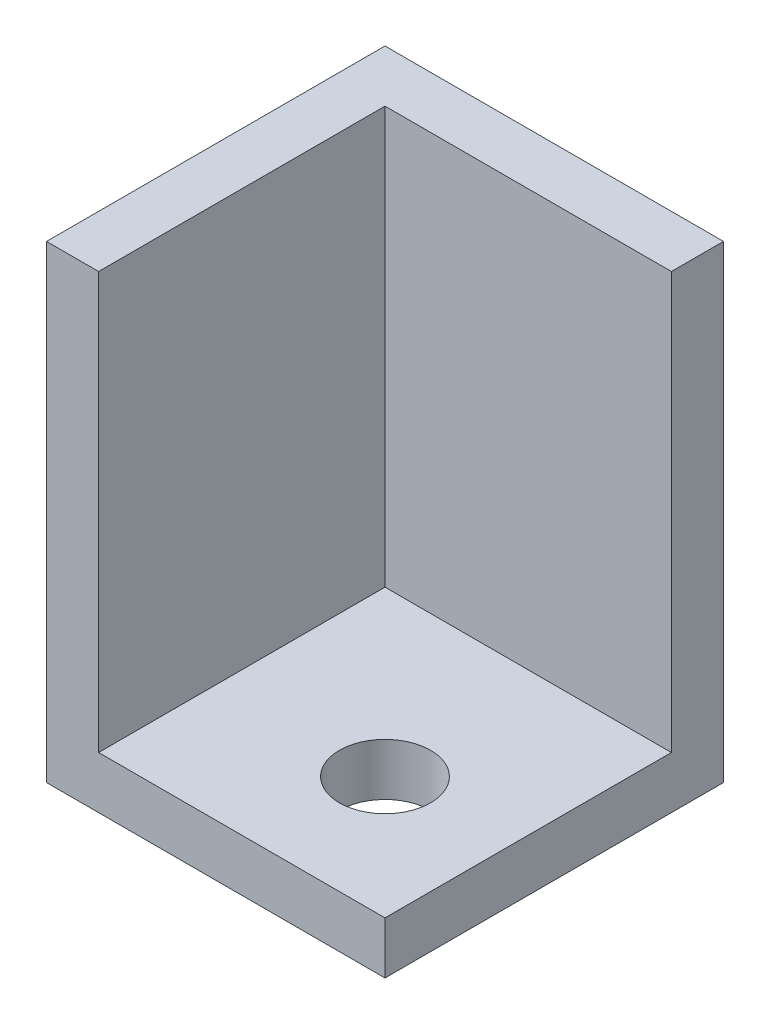
ISO-10303-21;
HEADER;
FILE_DESCRIPTION(('STEP AP214'),'2;1');
FILE_NAME('part.step','',(''),(''),'','','');
FILE_SCHEMA(('AUTOMOTIVE_DESIGN { 1 0 10303 214 1 1 1 1 }'));
ENDSEC;
DATA;
#1=APPLICATION_CONTEXT('core data for automotive mechanical design processes');
#2=APPLICATION_PROTOCOL_DEFINITION('international standard','automotive_design',2000,#1);
#3=PRODUCT_CONTEXT('',#1,'mechanical');
#4=PRODUCT('Part','Part','',(#3));
#5=PRODUCT_RELATED_PRODUCT_CATEGORY('part','',(#4));
#6=PRODUCT_DEFINITION_FORMATION('','',#4);
#7=PRODUCT_DEFINITION_CONTEXT('part definition',#1,'design');
#8=PRODUCT_DEFINITION('design','',#6,#7);
#9=PRODUCT_DEFINITION_SHAPE('','',#8);
#10=(LENGTH_UNIT() NAMED_UNIT(*) SI_UNIT(.MILLI.,.METRE.));
#11=(NAMED_UNIT(*) PLANE_ANGLE_UNIT() SI_UNIT($,.RADIAN.));
#12=(NAMED_UNIT(*) SI_UNIT($,.STERADIAN.) SOLID_ANGLE_UNIT());
#13=UNCERTAINTY_MEASURE_WITH_UNIT(LENGTH_MEASURE(1.E-05),#10,'distance_accuracy_value','');
#14=(GEOMETRIC_REPRESENTATION_CONTEXT(3) GLOBAL_UNCERTAINTY_ASSIGNED_CONTEXT((#13)) GLOBAL_UNIT_ASSIGNED_CONTEXT((#10,
#11,#12)) REPRESENTATION_CONTEXT('',''));
#15=CARTESIAN_POINT('',(0.,0.,0.));
#16=DIRECTION('',(0.,0.,1.));
#17=DIRECTION('',(1.,0.,0.));
#18=AXIS2_PLACEMENT_3D('',#15,#16,#17);
#19=CARTESIAN_POINT('',(-6.5,2.,6.5));
#20=DIRECTION('',(1.,0.,0.));
#21=DIRECTION('',(0.,0.,-1.));
#22=AXIS2_PLACEMENT_3D('',#19,#20,#21);
#23=PLANE('',#22);
#24=DIRECTION('',(0.,0.,1.));
#25=VECTOR('',#24,1.);
#26=CARTESIAN_POINT('',(-6.5,0.,6.5));
#27=LINE('',#26,#25);
#28=CARTESIAN_POINT('',(-6.5,0.,-6.5));
#29=VERTEX_POINT('',#28);
#30=CARTESIAN_POINT('',(-6.5,0.,6.5));
#31=VERTEX_POINT('',#30);
#32=EDGE_CURVE('E125',#29,#31,#27,.T.);
#33=ORIENTED_EDGE('',*,*,#32,.T.);
#34=DIRECTION('',(0.,-1.,0.));
#35=VECTOR('',#34,1.);
#36=CARTESIAN_POINT('',(-6.5,2.,6.5));
#37=LINE('',#36,#35);
#38=CARTESIAN_POINT('',(-6.5,18.,6.5));
#39=VERTEX_POINT('',#38);
#40=EDGE_CURVE('E11',#39,#31,#37,.T.);
#41=ORIENTED_EDGE('',*,*,#40,.F.);
#42=DIRECTION('',(0.,0.,1.));
#43=VECTOR('',#42,1.);
#44=CARTESIAN_POINT('',(-6.5,18.,0.));
#45=LINE('',#44,#43);
#46=CARTESIAN_POINT('',(-6.5,18.,-6.5));
#47=VERTEX_POINT('',#46);
#48=EDGE_CURVE('E176',#47,#39,#45,.T.);
#49=ORIENTED_EDGE('',*,*,#48,.F.);
#50=DIRECTION('',(0.,-1.,0.));
#51=VECTOR('',#50,1.);
#52=CARTESIAN_POINT('',(-6.5,2.,-6.5));
#53=LINE('',#52,#51);
#54=EDGE_CURVE('E142',#47,#29,#53,.T.);
#55=ORIENTED_EDGE('',*,*,#54,.T.);
#56=EDGE_LOOP('',(#33,#41,#49,#55));
#57=FACE_BOUND('',#56,.T.);
#58=ADVANCED_FACE('F41',(#57),#23,.F.);
#59=CARTESIAN_POINT('',(6.5,2.,6.5));
#60=DIRECTION('',(0.,0.,-1.));
#61=DIRECTION('',(-1.,0.,0.));
#62=AXIS2_PLACEMENT_3D('',#59,#60,#61);
#63=PLANE('',#62);
#64=DIRECTION('',(1.,0.,0.));
#65=VECTOR('',#64,1.);
#66=CARTESIAN_POINT('',(6.5,0.,6.5));
#67=LINE('',#66,#65);
#68=CARTESIAN_POINT('',(6.5,0.,6.5));
#69=VERTEX_POINT('',#68);
#70=EDGE_CURVE('E130',#31,#69,#67,.T.);
#71=ORIENTED_EDGE('',*,*,#70,.T.);
#72=DIRECTION('',(0.,-1.,0.));
#73=VECTOR('',#72,1.);
#74=CARTESIAN_POINT('',(6.5,2.,6.5));
#75=LINE('',#74,#73);
#76=CARTESIAN_POINT('',(6.5,2.,6.5));
#77=VERTEX_POINT('',#76);
#78=EDGE_CURVE('E50',#77,#69,#75,.T.);
#79=ORIENTED_EDGE('',*,*,#78,.F.);
#80=DIRECTION('',(1.,0.,0.));
#81=VECTOR('',#80,1.);
#82=CARTESIAN_POINT('',(6.5,2.,6.5));
#83=LINE('',#82,#81);
#84=CARTESIAN_POINT('',(-4.5,2.,6.5));
#85=VERTEX_POINT('',#84);
#86=EDGE_CURVE('E136',#85,#77,#83,.T.);
#87=ORIENTED_EDGE('',*,*,#86,.F.);
#88=DIRECTION('',(0.,-1.,0.));
#89=VECTOR('',#88,1.);
#90=CARTESIAN_POINT('',(-4.5,18.,6.5));
#91=LINE('',#90,#89);
#92=CARTESIAN_POINT('',(-4.5,18.,6.5));
#93=VERTEX_POINT('',#92);
#94=EDGE_CURVE('E132',#93,#85,#91,.T.);
#95=ORIENTED_EDGE('',*,*,#94,.F.);
#96=DIRECTION('',(1.,0.,0.));
#97=VECTOR('',#96,1.);
#98=CARTESIAN_POINT('',(0.,18.,6.5));
#99=LINE('',#98,#97);
#100=EDGE_CURVE('E117',#39,#93,#99,.T.);
#101=ORIENTED_EDGE('',*,*,#100,.F.);
#102=ORIENTED_EDGE('',*,*,#40,.T.);
#103=EDGE_LOOP('',(#71,#79,#87,#95,#101,#102));
#104=FACE_BOUND('',#103,.T.);
#105=ADVANCED_FACE('F190',(#104),#63,.F.);
#106=CARTESIAN_POINT('',(6.5,2.,6.5));
#107=DIRECTION('',(-1.,0.,0.));
#108=DIRECTION('',(0.,0.,1.));
#109=AXIS2_PLACEMENT_3D('',#106,#107,#108);
#110=PLANE('',#109);
#111=DIRECTION('',(0.,0.,-1.));
#112=VECTOR('',#111,1.);
#113=CARTESIAN_POINT('',(6.5,0.,6.5));
#114=LINE('',#113,#112);
#115=CARTESIAN_POINT('',(6.5,0.,-6.5));
#116=VERTEX_POINT('',#115);
#117=EDGE_CURVE('E146',#69,#116,#114,.T.);
#118=ORIENTED_EDGE('',*,*,#117,.T.);
#119=DIRECTION('',(0.,-1.,0.));
#120=VECTOR('',#119,1.);
#121=CARTESIAN_POINT('',(6.5,2.,-6.5));
#122=LINE('',#121,#120);
#123=CARTESIAN_POINT('',(6.5,18.,-6.5));
#124=VERTEX_POINT('',#123);
#125=EDGE_CURVE('E154',#124,#116,#122,.T.);
#126=ORIENTED_EDGE('',*,*,#125,.F.);
#127=DIRECTION('',(0.,0.,-1.));
#128=VECTOR('',#127,1.);
#129=CARTESIAN_POINT('',(6.5,18.,0.));
#130=LINE('',#129,#128);
#131=CARTESIAN_POINT('',(6.5,18.,-4.5));
#132=VERTEX_POINT('',#131);
#133=EDGE_CURVE('E110',#132,#124,#130,.T.);
#134=ORIENTED_EDGE('',*,*,#133,.F.);
#135=DIRECTION('',(0.,-1.,0.));
#136=VECTOR('',#135,1.);
#137=CARTESIAN_POINT('',(6.5,18.,-4.5));
#138=LINE('',#137,#136);
#139=CARTESIAN_POINT('',(6.5,2.,-4.5));
#140=VERTEX_POINT('',#139);
#141=EDGE_CURVE('E105',#132,#140,#138,.T.);
#142=ORIENTED_EDGE('',*,*,#141,.T.);
#143=DIRECTION('',(0.,0.,-1.));
#144=VECTOR('',#143,1.);
#145=CARTESIAN_POINT('',(6.5,2.,6.5));
#146=LINE('',#145,#144);
#147=EDGE_CURVE('E139',#77,#140,#146,.T.);
#148=ORIENTED_EDGE('',*,*,#147,.F.);
#149=ORIENTED_EDGE('',*,*,#78,.T.);
#150=EDGE_LOOP('',(#118,#126,#134,#142,#148,#149));
#151=FACE_BOUND('',#150,.T.);
#152=ADVANCED_FACE('F164',(#151),#110,.F.);
#153=CARTESIAN_POINT('',(6.5,2.,-6.5));
#154=DIRECTION('',(0.,0.,1.));
#155=DIRECTION('',(1.,0.,0.));
#156=AXIS2_PLACEMENT_3D('',#153,#154,#155);
#157=PLANE('',#156);
#158=DIRECTION('',(-1.,0.,0.));
#159=VECTOR('',#158,1.);
#160=CARTESIAN_POINT('',(6.5,0.,-6.5));
#161=LINE('',#160,#159);
#162=EDGE_CURVE('E140',#116,#29,#161,.T.);
#163=ORIENTED_EDGE('',*,*,#162,.T.);
#164=ORIENTED_EDGE('',*,*,#54,.F.);
#165=DIRECTION('',(-1.,0.,0.));
#166=VECTOR('',#165,1.);
#167=CARTESIAN_POINT('',(0.,18.,-6.5));
#168=LINE('',#167,#166);
#169=EDGE_CURVE('E178',#124,#47,#168,.T.);
#170=ORIENTED_EDGE('',*,*,#169,.F.);
#171=ORIENTED_EDGE('',*,*,#125,.T.);
#172=EDGE_LOOP('',(#163,#164,#170,#171));
#173=FACE_BOUND('',#172,.T.);
#174=ADVANCED_FACE('F171',(#173),#157,.F.);
#175=CARTESIAN_POINT('',(0.,2.,0.));
#176=DIRECTION('',(0.,1.,0.));
#177=DIRECTION('',(0.,0.,1.));
#178=AXIS2_PLACEMENT_3D('',#175,#176,#177);
#179=PLANE('',#178);
#180=CARTESIAN_POINT('',(1.8,2.,1.8));
#181=DIRECTION('',(0.,1.,0.));
#182=DIRECTION('',(0.,0.,1.));
#183=AXIS2_PLACEMENT_3D('',#180,#181,#182);
#184=CIRCLE('',#183,1.75);
#185=CARTESIAN_POINT('',(1.8,2.,3.55));
#186=VERTEX_POINT('',#185);
#187=EDGE_CURVE('E194',#186,#186,#184,.T.);
#188=ORIENTED_EDGE('',*,*,#187,.F.);
#189=EDGE_LOOP('',(#188));
#190=FACE_BOUND('',#189,.T.);
#191=DIRECTION('',(0.,0.,-1.));
#192=VECTOR('',#191,1.);
#193=CARTESIAN_POINT('',(-4.5,2.,0.));
#194=LINE('',#193,#192);
#195=CARTESIAN_POINT('',(-4.5,2.,-4.5));
#196=VERTEX_POINT('',#195);
#197=EDGE_CURVE('E62',#85,#196,#194,.T.);
#198=ORIENTED_EDGE('',*,*,#197,.F.);
#199=ORIENTED_EDGE('',*,*,#86,.T.);
#200=ORIENTED_EDGE('',*,*,#147,.T.);
#201=DIRECTION('',(1.,0.,0.));
#202=VECTOR('',#201,1.);
#203=CARTESIAN_POINT('',(0.,2.,-4.5));
#204=LINE('',#203,#202);
#205=EDGE_CURVE('E57',#196,#140,#204,.T.);
#206=ORIENTED_EDGE('',*,*,#205,.F.);
#207=EDGE_LOOP('',(#198,#199,#200,#206));
#208=FACE_BOUND('',#207,.T.);
#209=ADVANCED_FACE('F191',(#190,#208),#179,.T.);
#210=CARTESIAN_POINT('',(0.,0.,0.));
#211=DIRECTION('',(0.,1.,0.));
#212=DIRECTION('',(0.,0.,1.));
#213=AXIS2_PLACEMENT_3D('',#210,#211,#212);
#214=PLANE('',#213);
#215=CARTESIAN_POINT('',(1.8,0.,1.8));
#216=DIRECTION('',(0.,1.,0.));
#217=DIRECTION('',(0.,0.,1.));
#218=AXIS2_PLACEMENT_3D('',#215,#216,#217);
#219=CIRCLE('',#218,1.75);
#220=CARTESIAN_POINT('',(1.8,0.,3.55));
#221=VERTEX_POINT('',#220);
#222=EDGE_CURVE('E44',#221,#221,#219,.T.);
#223=ORIENTED_EDGE('',*,*,#222,.T.);
#224=EDGE_LOOP('',(#223));
#225=FACE_BOUND('',#224,.T.);
#226=ORIENTED_EDGE('',*,*,#32,.F.);
#227=ORIENTED_EDGE('',*,*,#162,.F.);
#228=ORIENTED_EDGE('',*,*,#117,.F.);
#229=ORIENTED_EDGE('',*,*,#70,.F.);
#230=EDGE_LOOP('',(#226,#227,#228,#229));
#231=FACE_BOUND('',#230,.T.);
#232=ADVANCED_FACE('F169',(#225,#231),#214,.F.);
#233=CARTESIAN_POINT('',(-4.5,18.,0.));
#234=DIRECTION('',(-1.,0.,0.));
#235=DIRECTION('',(0.,0.,1.));
#236=AXIS2_PLACEMENT_3D('',#233,#234,#235);
#237=PLANE('',#236);
#238=ORIENTED_EDGE('',*,*,#197,.T.);
#239=DIRECTION('',(0.,-1.,0.));
#240=VECTOR('',#239,1.);
#241=CARTESIAN_POINT('',(-4.5,18.,-4.5));
#242=LINE('',#241,#240);
#243=CARTESIAN_POINT('',(-4.5,18.,-4.5));
#244=VERTEX_POINT('',#243);
#245=EDGE_CURVE('E103',#244,#196,#242,.T.);
#246=ORIENTED_EDGE('',*,*,#245,.F.);
#247=DIRECTION('',(0.,0.,-1.));
#248=VECTOR('',#247,1.);
#249=CARTESIAN_POINT('',(-4.5,18.,0.));
#250=LINE('',#249,#248);
#251=EDGE_CURVE('E111',#93,#244,#250,.T.);
#252=ORIENTED_EDGE('',*,*,#251,.F.);
#253=ORIENTED_EDGE('',*,*,#94,.T.);
#254=EDGE_LOOP('',(#238,#246,#252,#253));
#255=FACE_BOUND('',#254,.T.);
#256=ADVANCED_FACE('F123',(#255),#237,.F.);
#257=CARTESIAN_POINT('',(0.,18.,-4.5));
#258=DIRECTION('',(0.,0.,-1.));
#259=DIRECTION('',(-1.,0.,0.));
#260=AXIS2_PLACEMENT_3D('',#257,#258,#259);
#261=PLANE('',#260);
#262=ORIENTED_EDGE('',*,*,#205,.T.);
#263=ORIENTED_EDGE('',*,*,#141,.F.);
#264=DIRECTION('',(1.,0.,0.));
#265=VECTOR('',#264,1.);
#266=CARTESIAN_POINT('',(0.,18.,-4.5));
#267=LINE('',#266,#265);
#268=EDGE_CURVE('E99',#244,#132,#267,.T.);
#269=ORIENTED_EDGE('',*,*,#268,.F.);
#270=ORIENTED_EDGE('',*,*,#245,.T.);
#271=EDGE_LOOP('',(#262,#263,#269,#270));
#272=FACE_BOUND('',#271,.T.);
#273=ADVANCED_FACE('F101',(#272),#261,.F.);
#274=CARTESIAN_POINT('',(0.,18.,0.));
#275=DIRECTION('',(0.,1.,0.));
#276=DIRECTION('',(0.,0.,1.));
#277=AXIS2_PLACEMENT_3D('',#274,#275,#276);
#278=PLANE('',#277);
#279=ORIENTED_EDGE('',*,*,#251,.T.);
#280=ORIENTED_EDGE('',*,*,#268,.T.);
#281=ORIENTED_EDGE('',*,*,#133,.T.);
#282=ORIENTED_EDGE('',*,*,#169,.T.);
#283=ORIENTED_EDGE('',*,*,#48,.T.);
#284=ORIENTED_EDGE('',*,*,#100,.T.);
#285=EDGE_LOOP('',(#279,#280,#281,#282,#283,#284));
#286=FACE_BOUND('',#285,.T.);
#287=ADVANCED_FACE('F114',(#286),#278,.T.);
#288=CARTESIAN_POINT('',(1.8,-18.,1.8));
#289=DIRECTION('',(0.,1.,0.));
#290=DIRECTION('',(0.,0.,1.));
#291=AXIS2_PLACEMENT_3D('',#288,#289,#290);
#292=CYLINDRICAL_SURFACE('',#291,1.75);
#293=ORIENTED_EDGE('',*,*,#187,.T.);
#294=EDGE_LOOP('',(#293));
#295=FACE_BOUND('',#294,.T.);
#296=ORIENTED_EDGE('',*,*,#222,.F.);
#297=EDGE_LOOP('',(#296));
#298=FACE_BOUND('',#297,.T.);
#299=ADVANCED_FACE('F204',(#295,#298),#292,.F.);
#300=CLOSED_SHELL('',(#58,#105,#152,#174,#209,#232,#256,#273,#287,#299));
#301=MANIFOLD_SOLID_BREP('B2',#300);
#302=ADVANCED_BREP_SHAPE_REPRESENTATION('',(#18,#301),#14);
#303=SHAPE_DEFINITION_REPRESENTATION(#9,#302);
ENDSEC;
END-ISO-10303-21;
